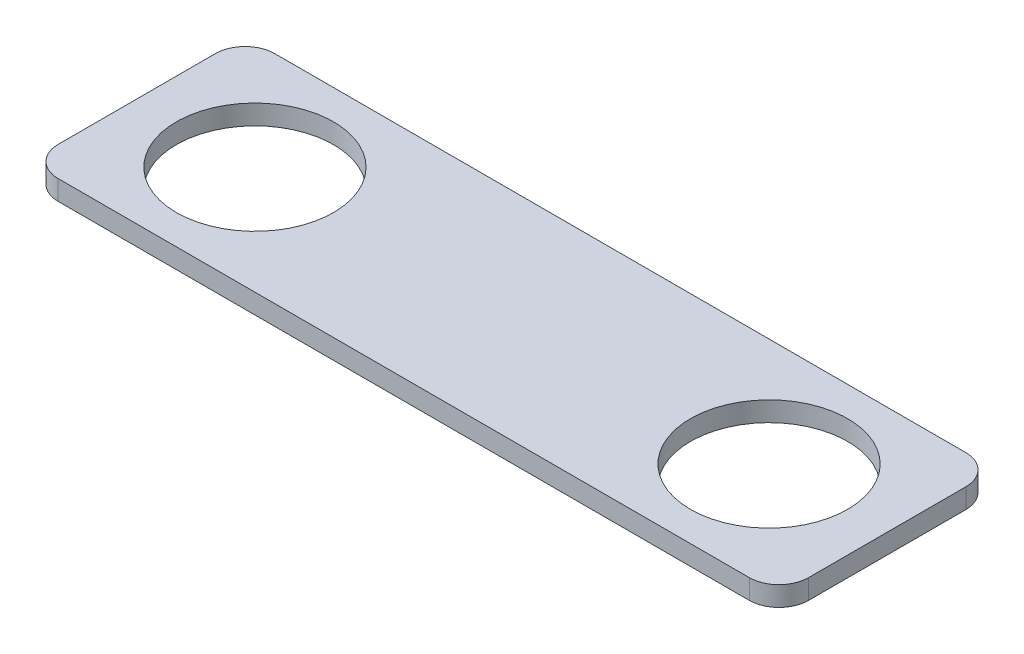
ISO-10303-21;
HEADER;
FILE_DESCRIPTION(('STEP AP214'),'2;1');
FILE_NAME('part.step','',(''),(''),'','','');
FILE_SCHEMA(('AUTOMOTIVE_DESIGN { 1 0 10303 214 1 1 1 1 }'));
ENDSEC;
DATA;
#1=APPLICATION_CONTEXT('core data for automotive mechanical design processes');
#2=APPLICATION_PROTOCOL_DEFINITION('international standard','automotive_design',2000,#1);
#3=PRODUCT_CONTEXT('',#1,'mechanical');
#4=PRODUCT('Part','Part','',(#3));
#5=PRODUCT_RELATED_PRODUCT_CATEGORY('part','',(#4));
#6=PRODUCT_DEFINITION_FORMATION('','',#4);
#7=PRODUCT_DEFINITION_CONTEXT('part definition',#1,'design');
#8=PRODUCT_DEFINITION('design','',#6,#7);
#9=PRODUCT_DEFINITION_SHAPE('','',#8);
#10=(LENGTH_UNIT() NAMED_UNIT(*) SI_UNIT(.MILLI.,.METRE.));
#11=(NAMED_UNIT(*) PLANE_ANGLE_UNIT() SI_UNIT($,.RADIAN.));
#12=(NAMED_UNIT(*) SI_UNIT($,.STERADIAN.) SOLID_ANGLE_UNIT());
#13=UNCERTAINTY_MEASURE_WITH_UNIT(LENGTH_MEASURE(1.E-05),#10,'distance_accuracy_value','');
#14=(GEOMETRIC_REPRESENTATION_CONTEXT(3) GLOBAL_UNCERTAINTY_ASSIGNED_CONTEXT((#13)) GLOBAL_UNIT_ASSIGNED_CONTEXT((#10,
#11,#12)) REPRESENTATION_CONTEXT('',''));
#15=CARTESIAN_POINT('',(0.,0.,0.));
#16=DIRECTION('',(0.,0.,1.));
#17=DIRECTION('',(1.,0.,0.));
#18=AXIS2_PLACEMENT_3D('',#15,#16,#17);
#19=CARTESIAN_POINT('',(-37.95,2.,10.95));
#20=DIRECTION('',(1.,0.,0.));
#21=DIRECTION('',(0.,0.,1.));
#22=AXIS2_PLACEMENT_3D('',#19,#20,#21);
#23=PLANE('',#22);
#24=DIRECTION('',(0.,0.,1.));
#25=VECTOR('',#24,1.);
#26=CARTESIAN_POINT('',(-37.95,2.,10.95));
#27=LINE('',#26,#25);
#28=CARTESIAN_POINT('',(-37.95,2.,-7.95));
#29=VERTEX_POINT('',#28);
#30=CARTESIAN_POINT('',(-37.95,2.,7.95));
#31=VERTEX_POINT('',#30);
#32=EDGE_CURVE('E146',#29,#31,#27,.T.);
#33=ORIENTED_EDGE('',*,*,#32,.F.);
#34=DIRECTION('',(0.,-1.,0.));
#35=VECTOR('',#34,1.);
#36=CARTESIAN_POINT('',(-37.95,2.,-7.95));
#37=LINE('',#36,#35);
#38=CARTESIAN_POINT('',(-37.95,0.,-7.95));
#39=VERTEX_POINT('',#38);
#40=EDGE_CURVE('E11',#29,#39,#37,.T.);
#41=ORIENTED_EDGE('',*,*,#40,.T.);
#42=DIRECTION('',(0.,0.,-1.));
#43=VECTOR('',#42,1.);
#44=CARTESIAN_POINT('',(-37.95,0.,0.));
#45=LINE('',#44,#43);
#46=CARTESIAN_POINT('',(-37.95,0.,7.95));
#47=VERTEX_POINT('',#46);
#48=EDGE_CURVE('E147',#39,#47,#45,.F.);
#49=ORIENTED_EDGE('',*,*,#48,.T.);
#50=DIRECTION('',(0.,-1.,0.));
#51=VECTOR('',#50,1.);
#52=CARTESIAN_POINT('',(-37.95,2.,7.95));
#53=LINE('',#52,#51);
#54=EDGE_CURVE('E51',#47,#31,#53,.F.);
#55=ORIENTED_EDGE('',*,*,#54,.T.);
#56=EDGE_LOOP('',(#33,#41,#49,#55));
#57=FACE_BOUND('',#56,.T.);
#58=ADVANCED_FACE('F43',(#57),#23,.F.);
#59=CARTESIAN_POINT('',(-37.95,2.,10.95));
#60=DIRECTION('',(0.,0.,-1.));
#61=DIRECTION('',(1.,0.,0.));
#62=AXIS2_PLACEMENT_3D('',#59,#60,#61);
#63=PLANE('',#62);
#64=DIRECTION('',(1.,0.,0.));
#65=VECTOR('',#64,1.);
#66=CARTESIAN_POINT('',(0.,0.,10.95));
#67=LINE('',#66,#65);
#68=CARTESIAN_POINT('',(-34.95,0.,10.95));
#69=VERTEX_POINT('',#68);
#70=CARTESIAN_POINT('',(34.95,0.,10.95));
#71=VERTEX_POINT('',#70);
#72=EDGE_CURVE('E169',#69,#71,#67,.T.);
#73=ORIENTED_EDGE('',*,*,#72,.T.);
#74=DIRECTION('',(0.,-1.,0.));
#75=VECTOR('',#74,1.);
#76=CARTESIAN_POINT('',(34.95,2.,10.95));
#77=LINE('',#76,#75);
#78=CARTESIAN_POINT('',(34.95,2.,10.95));
#79=VERTEX_POINT('',#78);
#80=EDGE_CURVE('E134',#71,#79,#77,.F.);
#81=ORIENTED_EDGE('',*,*,#80,.T.);
#82=DIRECTION('',(1.,0.,0.));
#83=VECTOR('',#82,1.);
#84=CARTESIAN_POINT('',(-37.95,2.,10.95));
#85=LINE('',#84,#83);
#86=CARTESIAN_POINT('',(-34.95,2.,10.95));
#87=VERTEX_POINT('',#86);
#88=EDGE_CURVE('E157',#87,#79,#85,.T.);
#89=ORIENTED_EDGE('',*,*,#88,.F.);
#90=DIRECTION('',(0.,-1.,0.));
#91=VECTOR('',#90,1.);
#92=CARTESIAN_POINT('',(-34.95,2.,10.95));
#93=LINE('',#92,#91);
#94=EDGE_CURVE('E137',#87,#69,#93,.T.);
#95=ORIENTED_EDGE('',*,*,#94,.T.);
#96=EDGE_LOOP('',(#73,#81,#89,#95));
#97=FACE_BOUND('',#96,.T.);
#98=ADVANCED_FACE('F200',(#97),#63,.F.);
#99=CARTESIAN_POINT('',(37.95,2.,10.95));
#100=DIRECTION('',(-1.,0.,0.));
#101=DIRECTION('',(0.,0.,-1.));
#102=AXIS2_PLACEMENT_3D('',#99,#100,#101);
#103=PLANE('',#102);
#104=DIRECTION('',(0.,0.,-1.));
#105=VECTOR('',#104,1.);
#106=CARTESIAN_POINT('',(37.95,0.,0.));
#107=LINE('',#106,#105);
#108=CARTESIAN_POINT('',(37.95,0.,7.95));
#109=VERTEX_POINT('',#108);
#110=CARTESIAN_POINT('',(37.95,0.,-7.95));
#111=VERTEX_POINT('',#110);
#112=EDGE_CURVE('E113',#109,#111,#107,.T.);
#113=ORIENTED_EDGE('',*,*,#112,.T.);
#114=DIRECTION('',(0.,-1.,0.));
#115=VECTOR('',#114,1.);
#116=CARTESIAN_POINT('',(37.95,2.,-7.95));
#117=LINE('',#116,#115);
#118=CARTESIAN_POINT('',(37.95,2.,-7.95));
#119=VERTEX_POINT('',#118);
#120=EDGE_CURVE('E119',#111,#119,#117,.F.);
#121=ORIENTED_EDGE('',*,*,#120,.T.);
#122=DIRECTION('',(0.,0.,-1.));
#123=VECTOR('',#122,1.);
#124=CARTESIAN_POINT('',(37.95,2.,10.95));
#125=LINE('',#124,#123);
#126=CARTESIAN_POINT('',(37.95,2.,7.95));
#127=VERTEX_POINT('',#126);
#128=EDGE_CURVE('E116',#127,#119,#125,.T.);
#129=ORIENTED_EDGE('',*,*,#128,.F.);
#130=DIRECTION('',(0.,-1.,0.));
#131=VECTOR('',#130,1.);
#132=CARTESIAN_POINT('',(37.95,2.,7.95));
#133=LINE('',#132,#131);
#134=EDGE_CURVE('E109',#127,#109,#133,.T.);
#135=ORIENTED_EDGE('',*,*,#134,.T.);
#136=EDGE_LOOP('',(#113,#121,#129,#135));
#137=FACE_BOUND('',#136,.T.);
#138=ADVANCED_FACE('F111',(#137),#103,.F.);
#139=CARTESIAN_POINT('',(-37.95,2.,-10.95));
#140=DIRECTION('',(0.,0.,1.));
#141=DIRECTION('',(-1.,0.,0.));
#142=AXIS2_PLACEMENT_3D('',#139,#140,#141);
#143=PLANE('',#142);
#144=DIRECTION('',(-1.,0.,0.));
#145=VECTOR('',#144,1.);
#146=CARTESIAN_POINT('',(-37.95,2.,-10.95));
#147=LINE('',#146,#145);
#148=CARTESIAN_POINT('',(34.95,2.,-10.95));
#149=VERTEX_POINT('',#148);
#150=CARTESIAN_POINT('',(-34.95,2.,-10.95));
#151=VERTEX_POINT('',#150);
#152=EDGE_CURVE('E158',#149,#151,#147,.T.);
#153=ORIENTED_EDGE('',*,*,#152,.F.);
#154=DIRECTION('',(0.,-1.,0.));
#155=VECTOR('',#154,1.);
#156=CARTESIAN_POINT('',(34.95,2.,-10.95));
#157=LINE('',#156,#155);
#158=CARTESIAN_POINT('',(34.95,0.,-10.95));
#159=VERTEX_POINT('',#158);
#160=EDGE_CURVE('E190',#149,#159,#157,.T.);
#161=ORIENTED_EDGE('',*,*,#160,.T.);
#162=DIRECTION('',(1.,0.,0.));
#163=VECTOR('',#162,1.);
#164=CARTESIAN_POINT('',(0.,0.,-10.95));
#165=LINE('',#164,#163);
#166=CARTESIAN_POINT('',(-34.95,0.,-10.95));
#167=VERTEX_POINT('',#166);
#168=EDGE_CURVE('E129',#159,#167,#165,.F.);
#169=ORIENTED_EDGE('',*,*,#168,.T.);
#170=DIRECTION('',(0.,-1.,0.));
#171=VECTOR('',#170,1.);
#172=CARTESIAN_POINT('',(-34.95,2.,-10.95));
#173=LINE('',#172,#171);
#174=EDGE_CURVE('E187',#167,#151,#173,.F.);
#175=ORIENTED_EDGE('',*,*,#174,.T.);
#176=EDGE_LOOP('',(#153,#161,#169,#175));
#177=FACE_BOUND('',#176,.T.);
#178=ADVANCED_FACE('F194',(#177),#143,.F.);
#179=CARTESIAN_POINT('',(26.,2.,0.));
#180=DIRECTION('',(0.,-1.,0.));
#181=DIRECTION('',(0.,0.,-1.));
#182=AXIS2_PLACEMENT_3D('',#179,#180,#181);
#183=CYLINDRICAL_SURFACE('',#182,7.95);
#184=CARTESIAN_POINT('',(26.,2.,0.));
#185=DIRECTION('',(0.,1.,0.));
#186=DIRECTION('',(0.,0.,1.));
#187=AXIS2_PLACEMENT_3D('',#184,#185,#186);
#188=CIRCLE('',#187,7.95);
#189=CARTESIAN_POINT('',(26.,2.,7.94999999999999));
#190=VERTEX_POINT('',#189);
#191=EDGE_CURVE('E160',#190,#190,#188,.T.);
#192=ORIENTED_EDGE('',*,*,#191,.T.);
#193=EDGE_LOOP('',(#192));
#194=FACE_BOUND('',#193,.T.);
#195=CARTESIAN_POINT('',(26.,0.,0.));
#196=DIRECTION('',(0.,1.,0.));
#197=DIRECTION('',(0.,0.,1.));
#198=AXIS2_PLACEMENT_3D('',#195,#196,#197);
#199=CIRCLE('',#198,7.95);
#200=CARTESIAN_POINT('',(26.,0.,7.94999999999999));
#201=VERTEX_POINT('',#200);
#202=EDGE_CURVE('E171',#201,#201,#199,.T.);
#203=ORIENTED_EDGE('',*,*,#202,.F.);
#204=EDGE_LOOP('',(#203));
#205=FACE_BOUND('',#204,.T.);
#206=ADVANCED_FACE('F219',(#194,#205),#183,.F.);
#207=CARTESIAN_POINT('',(-26.,2.,0.));
#208=DIRECTION('',(0.,-1.,0.));
#209=DIRECTION('',(0.,0.,-1.));
#210=AXIS2_PLACEMENT_3D('',#207,#208,#209);
#211=CYLINDRICAL_SURFACE('',#210,7.95);
#212=CARTESIAN_POINT('',(-26.,2.,0.));
#213=DIRECTION('',(0.,1.,0.));
#214=DIRECTION('',(0.,0.,1.));
#215=AXIS2_PLACEMENT_3D('',#212,#213,#214);
#216=CIRCLE('',#215,7.95);
#217=CARTESIAN_POINT('',(-26.,2.,7.95));
#218=VERTEX_POINT('',#217);
#219=EDGE_CURVE('E120',#218,#218,#216,.T.);
#220=ORIENTED_EDGE('',*,*,#219,.T.);
#221=EDGE_LOOP('',(#220));
#222=FACE_BOUND('',#221,.T.);
#223=CARTESIAN_POINT('',(-26.,0.,0.));
#224=DIRECTION('',(0.,1.,0.));
#225=DIRECTION('',(0.,0.,1.));
#226=AXIS2_PLACEMENT_3D('',#223,#224,#225);
#227=CIRCLE('',#226,7.95);
#228=CARTESIAN_POINT('',(-26.,0.,7.95));
#229=VERTEX_POINT('',#228);
#230=EDGE_CURVE('E177',#229,#229,#227,.T.);
#231=ORIENTED_EDGE('',*,*,#230,.F.);
#232=EDGE_LOOP('',(#231));
#233=FACE_BOUND('',#232,.T.);
#234=ADVANCED_FACE('F222',(#222,#233),#211,.F.);
#235=CARTESIAN_POINT('',(0.,2.,0.));
#236=DIRECTION('',(0.,-1.,0.));
#237=DIRECTION('',(0.,0.,-1.));
#238=AXIS2_PLACEMENT_3D('',#235,#236,#237);
#239=PLANE('',#238);
#240=ORIENTED_EDGE('',*,*,#128,.T.);
#241=CARTESIAN_POINT('',(34.95,2.,-7.95));
#242=DIRECTION('',(0.,-1.,0.));
#243=DIRECTION('',(0.,0.,-1.));
#244=AXIS2_PLACEMENT_3D('',#241,#242,#243);
#245=CIRCLE('',#244,3.);
#246=EDGE_CURVE('E185',#119,#149,#245,.F.);
#247=ORIENTED_EDGE('',*,*,#246,.T.);
#248=ORIENTED_EDGE('',*,*,#152,.T.);
#249=CARTESIAN_POINT('',(-34.95,2.,-7.95));
#250=DIRECTION('',(0.,-1.,0.));
#251=DIRECTION('',(0.,0.,-1.));
#252=AXIS2_PLACEMENT_3D('',#249,#250,#251);
#253=CIRCLE('',#252,3.);
#254=EDGE_CURVE('E156',#151,#29,#253,.F.);
#255=ORIENTED_EDGE('',*,*,#254,.T.);
#256=ORIENTED_EDGE('',*,*,#32,.T.);
#257=CARTESIAN_POINT('',(-34.95,2.,7.95));
#258=DIRECTION('',(0.,-1.,0.));
#259=DIRECTION('',(0.,0.,-1.));
#260=AXIS2_PLACEMENT_3D('',#257,#258,#259);
#261=CIRCLE('',#260,3.);
#262=EDGE_CURVE('E153',#31,#87,#261,.F.);
#263=ORIENTED_EDGE('',*,*,#262,.T.);
#264=ORIENTED_EDGE('',*,*,#88,.T.);
#265=CARTESIAN_POINT('',(34.95,2.,7.95));
#266=DIRECTION('',(0.,-1.,0.));
#267=DIRECTION('',(0.,0.,-1.));
#268=AXIS2_PLACEMENT_3D('',#265,#266,#267);
#269=CIRCLE('',#268,3.);
#270=EDGE_CURVE('E183',#79,#127,#269,.F.);
#271=ORIENTED_EDGE('',*,*,#270,.T.);
#272=EDGE_LOOP('',(#240,#247,#248,#255,#256,#263,#264,#271));
#273=FACE_BOUND('',#272,.T.);
#274=ORIENTED_EDGE('',*,*,#191,.F.);
#275=EDGE_LOOP('',(#274));
#276=FACE_BOUND('',#275,.T.);
#277=ORIENTED_EDGE('',*,*,#219,.F.);
#278=EDGE_LOOP('',(#277));
#279=FACE_BOUND('',#278,.T.);
#280=ADVANCED_FACE('F150',(#273,#276,#279),#239,.F.);
#281=CARTESIAN_POINT('',(0.,0.,0.));
#282=DIRECTION('',(0.,-1.,0.));
#283=DIRECTION('',(0.,0.,-1.));
#284=AXIS2_PLACEMENT_3D('',#281,#282,#283);
#285=PLANE('',#284);
#286=ORIENTED_EDGE('',*,*,#168,.F.);
#287=CARTESIAN_POINT('',(34.95,0.,-7.95));
#288=DIRECTION('',(0.,-1.,0.));
#289=DIRECTION('',(0.,0.,-1.));
#290=AXIS2_PLACEMENT_3D('',#287,#288,#289);
#291=CIRCLE('',#290,3.);
#292=EDGE_CURVE('E128',#159,#111,#291,.T.);
#293=ORIENTED_EDGE('',*,*,#292,.T.);
#294=ORIENTED_EDGE('',*,*,#112,.F.);
#295=CARTESIAN_POINT('',(34.95,0.,7.95));
#296=DIRECTION('',(0.,-1.,0.));
#297=DIRECTION('',(0.,0.,-1.));
#298=AXIS2_PLACEMENT_3D('',#295,#296,#297);
#299=CIRCLE('',#298,3.);
#300=EDGE_CURVE('E125',#109,#71,#299,.T.);
#301=ORIENTED_EDGE('',*,*,#300,.T.);
#302=ORIENTED_EDGE('',*,*,#72,.F.);
#303=CARTESIAN_POINT('',(-34.95,0.,7.95));
#304=DIRECTION('',(0.,-1.,0.));
#305=DIRECTION('',(0.,0.,-1.));
#306=AXIS2_PLACEMENT_3D('',#303,#304,#305);
#307=CIRCLE('',#306,3.);
#308=EDGE_CURVE('E58',#69,#47,#307,.T.);
#309=ORIENTED_EDGE('',*,*,#308,.T.);
#310=ORIENTED_EDGE('',*,*,#48,.F.);
#311=CARTESIAN_POINT('',(-34.95,0.,-7.95));
#312=DIRECTION('',(0.,-1.,0.));
#313=DIRECTION('',(0.,0.,-1.));
#314=AXIS2_PLACEMENT_3D('',#311,#312,#313);
#315=CIRCLE('',#314,3.);
#316=EDGE_CURVE('E135',#39,#167,#315,.T.);
#317=ORIENTED_EDGE('',*,*,#316,.T.);
#318=EDGE_LOOP('',(#286,#293,#294,#301,#302,#309,#310,#317));
#319=FACE_BOUND('',#318,.T.);
#320=ORIENTED_EDGE('',*,*,#202,.T.);
#321=EDGE_LOOP('',(#320));
#322=FACE_BOUND('',#321,.T.);
#323=ORIENTED_EDGE('',*,*,#230,.T.);
#324=EDGE_LOOP('',(#323));
#325=FACE_BOUND('',#324,.T.);
#326=ADVANCED_FACE('F123',(#319,#322,#325),#285,.T.);
#327=CARTESIAN_POINT('',(34.95,2.,-7.95));
#328=DIRECTION('',(0.,1.,0.));
#329=DIRECTION('',(0.,0.,1.));
#330=AXIS2_PLACEMENT_3D('',#327,#328,#329);
#331=CYLINDRICAL_SURFACE('',#330,3.);
#332=ORIENTED_EDGE('',*,*,#292,.F.);
#333=ORIENTED_EDGE('',*,*,#160,.F.);
#334=ORIENTED_EDGE('',*,*,#246,.F.);
#335=ORIENTED_EDGE('',*,*,#120,.F.);
#336=EDGE_LOOP('',(#332,#333,#334,#335));
#337=FACE_BOUND('',#336,.T.);
#338=ADVANCED_FACE('F198',(#337),#331,.T.);
#339=CARTESIAN_POINT('',(34.95,2.,7.95));
#340=DIRECTION('',(0.,1.,0.));
#341=DIRECTION('',(0.,0.,1.));
#342=AXIS2_PLACEMENT_3D('',#339,#340,#341);
#343=CYLINDRICAL_SURFACE('',#342,3.);
#344=ORIENTED_EDGE('',*,*,#300,.F.);
#345=ORIENTED_EDGE('',*,*,#134,.F.);
#346=ORIENTED_EDGE('',*,*,#270,.F.);
#347=ORIENTED_EDGE('',*,*,#80,.F.);
#348=EDGE_LOOP('',(#344,#345,#346,#347));
#349=FACE_BOUND('',#348,.T.);
#350=ADVANCED_FACE('F132',(#349),#343,.T.);
#351=CARTESIAN_POINT('',(-34.95,2.,-7.95));
#352=DIRECTION('',(0.,1.,0.));
#353=DIRECTION('',(0.,0.,1.));
#354=AXIS2_PLACEMENT_3D('',#351,#352,#353);
#355=CYLINDRICAL_SURFACE('',#354,3.);
#356=ORIENTED_EDGE('',*,*,#316,.F.);
#357=ORIENTED_EDGE('',*,*,#40,.F.);
#358=ORIENTED_EDGE('',*,*,#254,.F.);
#359=ORIENTED_EDGE('',*,*,#174,.F.);
#360=EDGE_LOOP('',(#356,#357,#358,#359));
#361=FACE_BOUND('',#360,.T.);
#362=ADVANCED_FACE('F203',(#361),#355,.T.);
#363=CARTESIAN_POINT('',(-34.95,2.,7.95));
#364=DIRECTION('',(0.,1.,0.));
#365=DIRECTION('',(0.,0.,1.));
#366=AXIS2_PLACEMENT_3D('',#363,#364,#365);
#367=CYLINDRICAL_SURFACE('',#366,3.);
#368=ORIENTED_EDGE('',*,*,#308,.F.);
#369=ORIENTED_EDGE('',*,*,#94,.F.);
#370=ORIENTED_EDGE('',*,*,#262,.F.);
#371=ORIENTED_EDGE('',*,*,#54,.F.);
#372=EDGE_LOOP('',(#368,#369,#370,#371));
#373=FACE_BOUND('',#372,.T.);
#374=ADVANCED_FACE('F45',(#373),#367,.T.);
#375=CLOSED_SHELL('',(#58,#98,#138,#178,#206,#234,#280,#326,#338,#350,#362,#374));
#376=MANIFOLD_SOLID_BREP('B2',#375);
#377=ADVANCED_BREP_SHAPE_REPRESENTATION('',(#18,#376),#14);
#378=SHAPE_DEFINITION_REPRESENTATION(#9,#377);
ENDSEC;
END-ISO-10303-21;
